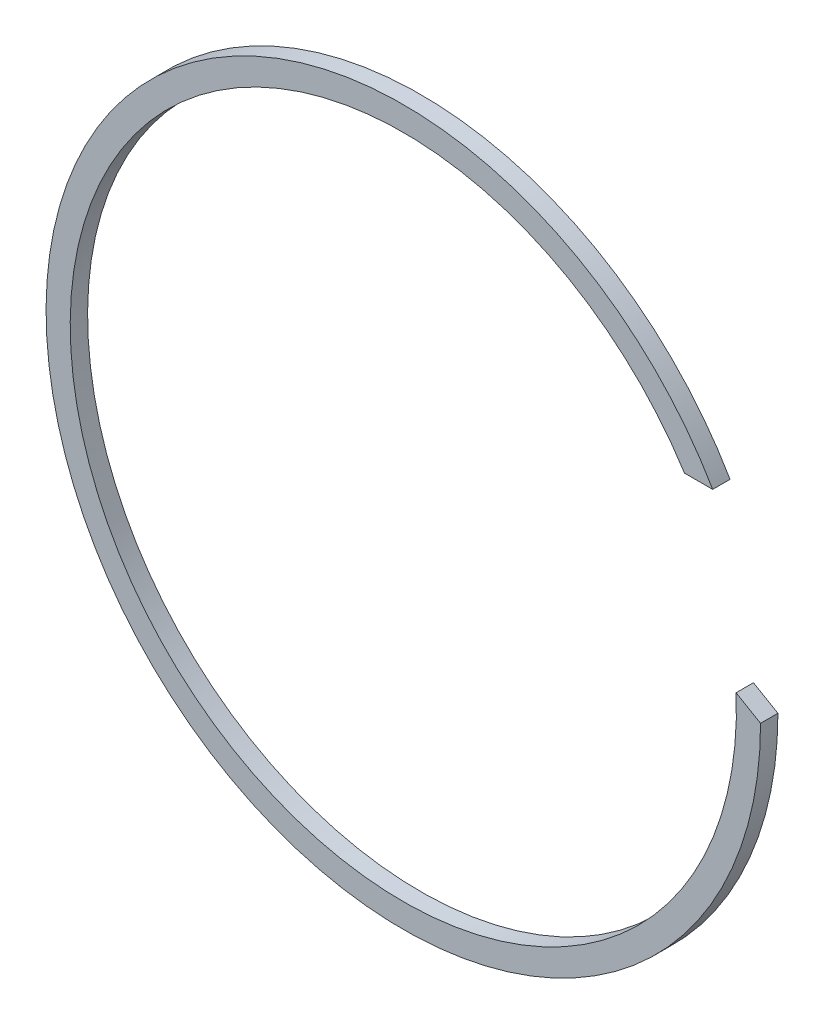
ISO-10303-21;
HEADER;
FILE_DESCRIPTION(('STEP AP214'),'2;1');
FILE_NAME('part.step','',(''),(''),'','','');
FILE_SCHEMA(('AUTOMOTIVE_DESIGN { 1 0 10303 214 1 1 1 1 }'));
ENDSEC;
DATA;
#1=APPLICATION_CONTEXT('core data for automotive mechanical design processes');
#2=APPLICATION_PROTOCOL_DEFINITION('international standard','automotive_design',2000,#1);
#3=PRODUCT_CONTEXT('',#1,'mechanical');
#4=PRODUCT('Part','Part','',(#3));
#5=PRODUCT_RELATED_PRODUCT_CATEGORY('part','',(#4));
#6=PRODUCT_DEFINITION_FORMATION('','',#4);
#7=PRODUCT_DEFINITION_CONTEXT('part definition',#1,'design');
#8=PRODUCT_DEFINITION('design','',#6,#7);
#9=PRODUCT_DEFINITION_SHAPE('','',#8);
#10=(LENGTH_UNIT() NAMED_UNIT(*) SI_UNIT(.MILLI.,.METRE.));
#11=(NAMED_UNIT(*) PLANE_ANGLE_UNIT() SI_UNIT($,.RADIAN.));
#12=(NAMED_UNIT(*) SI_UNIT($,.STERADIAN.) SOLID_ANGLE_UNIT());
#13=UNCERTAINTY_MEASURE_WITH_UNIT(LENGTH_MEASURE(1.E-05),#10,'distance_accuracy_value','');
#14=(GEOMETRIC_REPRESENTATION_CONTEXT(3) GLOBAL_UNCERTAINTY_ASSIGNED_CONTEXT((#13)) GLOBAL_UNIT_ASSIGNED_CONTEXT((#10,
#11,#12)) REPRESENTATION_CONTEXT('',''));
#15=CARTESIAN_POINT('',(0.,0.,0.));
#16=DIRECTION('',(0.,0.,1.));
#17=DIRECTION('',(1.,0.,0.));
#18=AXIS2_PLACEMENT_3D('',#15,#16,#17);
#19=CARTESIAN_POINT('',(0.,0.,1.8));
#20=DIRECTION('',(0.,0.,-1.));
#21=DIRECTION('',(-1.,0.,0.));
#22=AXIS2_PLACEMENT_3D('',#19,#20,#21);
#23=CYLINDRICAL_SURFACE('',#22,37.);
#24=CARTESIAN_POINT('',(0.,0.,0.));
#25=DIRECTION('',(0.,0.,1.));
#26=DIRECTION('',(1.,0.,0.));
#27=AXIS2_PLACEMENT_3D('',#24,#25,#26);
#28=CIRCLE('',#27,37.);
#29=CARTESIAN_POINT('',(32.0429399400242,18.5,0.));
#30=VERTEX_POINT('',#29);
#31=CARTESIAN_POINT('',(37.,0.,0.));
#32=VERTEX_POINT('',#31);
#33=EDGE_CURVE('E96',#30,#32,#28,.T.);
#34=ORIENTED_EDGE('',*,*,#33,.T.);
#35=DIRECTION('',(0.,0.,-1.));
#36=VECTOR('',#35,1.);
#37=CARTESIAN_POINT('',(37.,0.,1.8));
#38=LINE('',#37,#36);
#39=CARTESIAN_POINT('',(37.,0.,1.8));
#40=VERTEX_POINT('',#39);
#41=EDGE_CURVE('E11',#40,#32,#38,.T.);
#42=ORIENTED_EDGE('',*,*,#41,.F.);
#43=CARTESIAN_POINT('',(0.,0.,1.8));
#44=DIRECTION('',(0.,0.,1.));
#45=DIRECTION('',(1.,0.,0.));
#46=AXIS2_PLACEMENT_3D('',#43,#44,#45);
#47=CIRCLE('',#46,37.);
#48=CARTESIAN_POINT('',(32.0429399400242,18.5,1.8));
#49=VERTEX_POINT('',#48);
#50=EDGE_CURVE('E84',#49,#40,#47,.T.);
#51=ORIENTED_EDGE('',*,*,#50,.F.);
#52=DIRECTION('',(0.,0.,-1.));
#53=VECTOR('',#52,1.);
#54=CARTESIAN_POINT('',(32.0429399400242,18.5,1.8));
#55=LINE('',#54,#53);
#56=EDGE_CURVE('E92',#49,#30,#55,.T.);
#57=ORIENTED_EDGE('',*,*,#56,.T.);
#58=EDGE_LOOP('',(#34,#42,#51,#57));
#59=FACE_BOUND('',#58,.T.);
#60=ADVANCED_FACE('F33',(#59),#23,.T.);
#61=CARTESIAN_POINT('',(37.,0.,1.8));
#62=DIRECTION('',(-0.503481592523063,-0.864005952520259,0.));
#63=DIRECTION('',(0.864005952520259,-0.503481592523063,0.));
#64=AXIS2_PLACEMENT_3D('',#61,#62,#63);
#65=PLANE('',#64);
#66=DIRECTION('',(-0.864005952520259,0.503481592523063,0.));
#67=VECTOR('',#66,1.);
#68=CARTESIAN_POINT('',(37.,0.,0.));
#69=LINE('',#68,#67);
#70=CARTESIAN_POINT('',(34.4684457573513,1.47521085697312,0.));
#71=VERTEX_POINT('',#70);
#72=EDGE_CURVE('E88',#32,#71,#69,.T.);
#73=ORIENTED_EDGE('',*,*,#72,.T.);
#74=DIRECTION('',(0.,0.,-1.));
#75=VECTOR('',#74,1.);
#76=CARTESIAN_POINT('',(34.4684457573513,1.47521085697312,1.8));
#77=LINE('',#76,#75);
#78=CARTESIAN_POINT('',(34.4684457573513,1.47521085697312,1.8));
#79=VERTEX_POINT('',#78);
#80=EDGE_CURVE('E41',#79,#71,#77,.T.);
#81=ORIENTED_EDGE('',*,*,#80,.F.);
#82=DIRECTION('',(-0.864005952520259,0.503481592523063,0.));
#83=VECTOR('',#82,1.);
#84=CARTESIAN_POINT('',(37.,0.,1.8));
#85=LINE('',#84,#83);
#86=EDGE_CURVE('E79',#40,#79,#85,.T.);
#87=ORIENTED_EDGE('',*,*,#86,.F.);
#88=ORIENTED_EDGE('',*,*,#41,.T.);
#89=EDGE_LOOP('',(#73,#81,#87,#88));
#90=FACE_BOUND('',#89,.T.);
#91=ADVANCED_FACE('F87',(#90),#65,.F.);
#92=CARTESIAN_POINT('',(0.,0.,1.8));
#93=DIRECTION('',(0.,0.,-1.));
#94=DIRECTION('',(-1.,0.,0.));
#95=AXIS2_PLACEMENT_3D('',#92,#93,#94);
#96=CYLINDRICAL_SURFACE('',#95,34.5);
#97=CARTESIAN_POINT('',(0.,0.,0.));
#98=DIRECTION('',(0.,0.,-1.));
#99=DIRECTION('',(1.,0.,0.));
#100=AXIS2_PLACEMENT_3D('',#97,#98,#99);
#101=CIRCLE('',#100,34.5);
#102=CARTESIAN_POINT('',(29.120439557122,18.5,0.));
#103=VERTEX_POINT('',#102);
#104=EDGE_CURVE('E66',#71,#103,#101,.T.);
#105=ORIENTED_EDGE('',*,*,#104,.T.);
#106=DIRECTION('',(0.,0.,-1.));
#107=VECTOR('',#106,1.);
#108=CARTESIAN_POINT('',(29.120439557122,18.5,1.8));
#109=LINE('',#108,#107);
#110=CARTESIAN_POINT('',(29.120439557122,18.5,1.8));
#111=VERTEX_POINT('',#110);
#112=EDGE_CURVE('E89',#111,#103,#109,.T.);
#113=ORIENTED_EDGE('',*,*,#112,.F.);
#114=CARTESIAN_POINT('',(0.,0.,1.8));
#115=DIRECTION('',(0.,0.,-1.));
#116=DIRECTION('',(1.,0.,0.));
#117=AXIS2_PLACEMENT_3D('',#114,#115,#116);
#118=CIRCLE('',#117,34.5);
#119=EDGE_CURVE('E82',#79,#111,#118,.T.);
#120=ORIENTED_EDGE('',*,*,#119,.F.);
#121=ORIENTED_EDGE('',*,*,#80,.T.);
#122=EDGE_LOOP('',(#105,#113,#120,#121));
#123=FACE_BOUND('',#122,.T.);
#124=ADVANCED_FACE('F90',(#123),#96,.F.);
#125=CARTESIAN_POINT('',(32.0429399400242,18.5,1.8));
#126=DIRECTION('',(0.,1.,0.));
#127=DIRECTION('',(-1.,0.,0.));
#128=AXIS2_PLACEMENT_3D('',#125,#126,#127);
#129=PLANE('',#128);
#130=DIRECTION('',(1.,0.,0.));
#131=VECTOR('',#130,1.);
#132=CARTESIAN_POINT('',(32.0429399400242,18.5,0.));
#133=LINE('',#132,#131);
#134=EDGE_CURVE('E72',#103,#30,#133,.T.);
#135=ORIENTED_EDGE('',*,*,#134,.T.);
#136=ORIENTED_EDGE('',*,*,#56,.F.);
#137=DIRECTION('',(1.,0.,0.));
#138=VECTOR('',#137,1.);
#139=CARTESIAN_POINT('',(32.0429399400242,18.5,1.8));
#140=LINE('',#139,#138);
#141=EDGE_CURVE('E49',#111,#49,#140,.T.);
#142=ORIENTED_EDGE('',*,*,#141,.F.);
#143=ORIENTED_EDGE('',*,*,#112,.T.);
#144=EDGE_LOOP('',(#135,#136,#142,#143));
#145=FACE_BOUND('',#144,.T.);
#146=ADVANCED_FACE('F103',(#145),#129,.F.);
#147=CARTESIAN_POINT('',(0.,0.,1.8));
#148=DIRECTION('',(0.,0.,1.));
#149=DIRECTION('',(1.,0.,0.));
#150=AXIS2_PLACEMENT_3D('',#147,#148,#149);
#151=PLANE('',#150);
#152=ORIENTED_EDGE('',*,*,#50,.T.);
#153=ORIENTED_EDGE('',*,*,#86,.T.);
#154=ORIENTED_EDGE('',*,*,#119,.T.);
#155=ORIENTED_EDGE('',*,*,#141,.T.);
#156=EDGE_LOOP('',(#152,#153,#154,#155));
#157=FACE_BOUND('',#156,.T.);
#158=ADVANCED_FACE('F80',(#157),#151,.T.);
#159=CARTESIAN_POINT('',(0.,0.,0.));
#160=DIRECTION('',(0.,0.,1.));
#161=DIRECTION('',(1.,0.,0.));
#162=AXIS2_PLACEMENT_3D('',#159,#160,#161);
#163=PLANE('',#162);
#164=ORIENTED_EDGE('',*,*,#33,.F.);
#165=ORIENTED_EDGE('',*,*,#134,.F.);
#166=ORIENTED_EDGE('',*,*,#104,.F.);
#167=ORIENTED_EDGE('',*,*,#72,.F.);
#168=EDGE_LOOP('',(#164,#165,#166,#167));
#169=FACE_BOUND('',#168,.T.);
#170=ADVANCED_FACE('F106',(#169),#163,.F.);
#171=CLOSED_SHELL('',(#60,#91,#124,#146,#158,#170));
#172=MANIFOLD_SOLID_BREP('B2',#171);
#173=ADVANCED_BREP_SHAPE_REPRESENTATION('',(#18,#172),#14);
#174=SHAPE_DEFINITION_REPRESENTATION(#9,#173);
ENDSEC;
END-ISO-10303-21;
